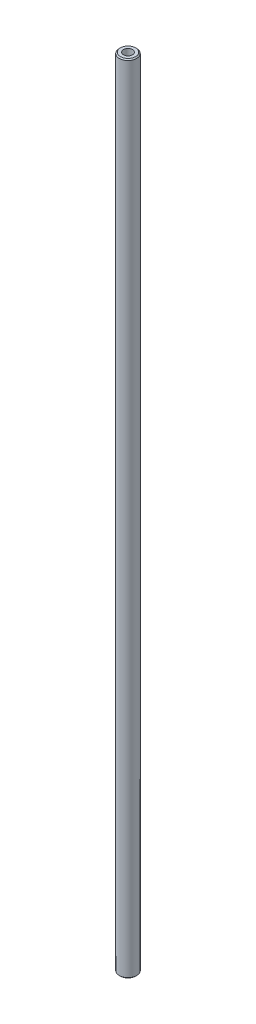
ISO-10303-21;
HEADER;
FILE_DESCRIPTION(('STEP AP214'),'2;1');
FILE_NAME('part.step','',(''),(''),'','','');
FILE_SCHEMA(('AUTOMOTIVE_DESIGN { 1 0 10303 214 1 1 1 1 }'));
ENDSEC;
DATA;
#1=APPLICATION_CONTEXT('core data for automotive mechanical design processes');
#2=APPLICATION_PROTOCOL_DEFINITION('international standard','automotive_design',2000,#1);
#3=PRODUCT_CONTEXT('',#1,'mechanical');
#4=PRODUCT('Part','Part','',(#3));
#5=PRODUCT_RELATED_PRODUCT_CATEGORY('part','',(#4));
#6=PRODUCT_DEFINITION_FORMATION('','',#4);
#7=PRODUCT_DEFINITION_CONTEXT('part definition',#1,'design');
#8=PRODUCT_DEFINITION('design','',#6,#7);
#9=PRODUCT_DEFINITION_SHAPE('','',#8);
#10=(LENGTH_UNIT() NAMED_UNIT(*) SI_UNIT(.MILLI.,.METRE.));
#11=(NAMED_UNIT(*) PLANE_ANGLE_UNIT() SI_UNIT($,.RADIAN.));
#12=(NAMED_UNIT(*) SI_UNIT($,.STERADIAN.) SOLID_ANGLE_UNIT());
#13=UNCERTAINTY_MEASURE_WITH_UNIT(LENGTH_MEASURE(1.E-05),#10,'distance_accuracy_value','');
#14=(GEOMETRIC_REPRESENTATION_CONTEXT(3) GLOBAL_UNCERTAINTY_ASSIGNED_CONTEXT((#13)) GLOBAL_UNIT_ASSIGNED_CONTEXT((#10,
#11,#12)) REPRESENTATION_CONTEXT('',''));
#15=CARTESIAN_POINT('',(0.,0.,0.));
#16=DIRECTION('',(0.,0.,1.));
#17=DIRECTION('',(1.,0.,0.));
#18=AXIS2_PLACEMENT_3D('',#15,#16,#17);
#19=CARTESIAN_POINT('',(0.,183.5,0.));
#20=DIRECTION('',(0.,-1.,0.));
#21=DIRECTION('',(0.,0.,-1.));
#22=AXIS2_PLACEMENT_3D('',#19,#20,#21);
#23=CYLINDRICAL_SURFACE('',#22,4.);
#24=CARTESIAN_POINT('',(0.,-183.,0.));
#25=DIRECTION('',(0.,1.,0.));
#26=DIRECTION('',(0.,0.,1.));
#27=AXIS2_PLACEMENT_3D('',#24,#25,#26);
#28=CIRCLE('',#27,4.);
#29=CARTESIAN_POINT('',(0.,-183.,4.));
#30=VERTEX_POINT('',#29);
#31=EDGE_CURVE('E76',#30,#30,#28,.T.);
#32=ORIENTED_EDGE('',*,*,#31,.T.);
#33=EDGE_LOOP('',(#32));
#34=FACE_BOUND('',#33,.T.);
#35=CARTESIAN_POINT('',(0.,183.,0.));
#36=DIRECTION('',(0.,1.,0.));
#37=DIRECTION('',(0.,0.,1.));
#38=AXIS2_PLACEMENT_3D('',#35,#36,#37);
#39=CIRCLE('',#38,4.);
#40=CARTESIAN_POINT('',(0.,183.,4.));
#41=VERTEX_POINT('',#40);
#42=EDGE_CURVE('E73',#41,#41,#39,.F.);
#43=ORIENTED_EDGE('',*,*,#42,.T.);
#44=EDGE_LOOP('',(#43));
#45=FACE_BOUND('',#44,.T.);
#46=ADVANCED_FACE('F38',(#34,#45),#23,.T.);
#47=CARTESIAN_POINT('',(0.,183.5,0.));
#48=DIRECTION('',(0.,1.,0.));
#49=DIRECTION('',(0.,0.,1.));
#50=AXIS2_PLACEMENT_3D('',#47,#48,#49);
#51=PLANE('',#50);
#52=CARTESIAN_POINT('',(0.,183.5,0.));
#53=DIRECTION('',(0.,1.,0.));
#54=DIRECTION('',(0.,0.,1.));
#55=AXIS2_PLACEMENT_3D('',#52,#53,#54);
#56=CIRCLE('',#55,2.09999999999999);
#57=CARTESIAN_POINT('',(0.,183.5,2.09999999999999));
#58=VERTEX_POINT('',#57);
#59=EDGE_CURVE('E62',#58,#58,#56,.T.);
#60=ORIENTED_EDGE('',*,*,#59,.F.);
#61=EDGE_LOOP('',(#60));
#62=FACE_BOUND('',#61,.T.);
#63=CARTESIAN_POINT('',(0.,183.5,0.));
#64=DIRECTION('',(0.,1.,0.));
#65=DIRECTION('',(0.,0.,1.));
#66=AXIS2_PLACEMENT_3D('',#63,#64,#65);
#67=CIRCLE('',#66,3.5);
#68=CARTESIAN_POINT('',(0.,183.5,3.5));
#69=VERTEX_POINT('',#68);
#70=EDGE_CURVE('E11',#69,#69,#67,.T.);
#71=ORIENTED_EDGE('',*,*,#70,.T.);
#72=EDGE_LOOP('',(#71));
#73=FACE_BOUND('',#72,.T.);
#74=ADVANCED_FACE('F90',(#62,#73),#51,.T.);
#75=CARTESIAN_POINT('',(0.,-183.5,0.));
#76=DIRECTION('',(0.,1.,0.));
#77=DIRECTION('',(0.,0.,1.));
#78=AXIS2_PLACEMENT_3D('',#75,#76,#77);
#79=PLANE('',#78);
#80=CARTESIAN_POINT('',(0.,-183.5,0.));
#81=DIRECTION('',(0.,-1.,0.));
#82=DIRECTION('',(0.,0.,-1.));
#83=AXIS2_PLACEMENT_3D('',#80,#81,#82);
#84=CIRCLE('',#83,2.09999999999999);
#85=CARTESIAN_POINT('',(0.,-183.5,-2.09999999999999));
#86=VERTEX_POINT('',#85);
#87=EDGE_CURVE('E63',#86,#86,#84,.T.);
#88=ORIENTED_EDGE('',*,*,#87,.F.);
#89=EDGE_LOOP('',(#88));
#90=FACE_BOUND('',#89,.T.);
#91=CARTESIAN_POINT('',(0.,-183.5,0.));
#92=DIRECTION('',(0.,1.,0.));
#93=DIRECTION('',(0.,0.,1.));
#94=AXIS2_PLACEMENT_3D('',#91,#92,#93);
#95=CIRCLE('',#94,3.49999999999995);
#96=CARTESIAN_POINT('',(0.,-183.5,3.49999999999995));
#97=VERTEX_POINT('',#96);
#98=EDGE_CURVE('E46',#97,#97,#95,.F.);
#99=ORIENTED_EDGE('',*,*,#98,.T.);
#100=EDGE_LOOP('',(#99));
#101=FACE_BOUND('',#100,.T.);
#102=ADVANCED_FACE('F81',(#90,#101),#79,.F.);
#103=CARTESIAN_POINT('',(0.,-183.,0.));
#104=DIRECTION('',(0.,1.,0.));
#105=DIRECTION('',(0.,0.,1.));
#106=AXIS2_PLACEMENT_3D('',#103,#104,#105);
#107=CONICAL_SURFACE('',#106,4.,0.785398163397445);
#108=ORIENTED_EDGE('',*,*,#98,.F.);
#109=EDGE_LOOP('',(#108));
#110=FACE_BOUND('',#109,.T.);
#111=ORIENTED_EDGE('',*,*,#31,.F.);
#112=EDGE_LOOP('',(#111));
#113=FACE_BOUND('',#112,.T.);
#114=ADVANCED_FACE('F83',(#110,#113),#107,.T.);
#115=CARTESIAN_POINT('',(0.,183.5,0.));
#116=DIRECTION('',(0.,-1.,0.));
#117=DIRECTION('',(0.,0.,-1.));
#118=AXIS2_PLACEMENT_3D('',#115,#116,#117);
#119=CONICAL_SURFACE('',#118,3.5,0.785398163397445);
#120=ORIENTED_EDGE('',*,*,#42,.F.);
#121=EDGE_LOOP('',(#120));
#122=FACE_BOUND('',#121,.T.);
#123=ORIENTED_EDGE('',*,*,#70,.F.);
#124=EDGE_LOOP('',(#123));
#125=FACE_BOUND('',#124,.T.);
#126=ADVANCED_FACE('F40',(#122,#125),#119,.T.);
#127=CARTESIAN_POINT('',(0.,159.5,0.));
#128=DIRECTION('',(0.,1.,0.));
#129=DIRECTION('',(0.,0.,1.));
#130=AXIS2_PLACEMENT_3D('',#127,#128,#129);
#131=CONICAL_SURFACE('',#130,2.09999999999999,1.02974425867665);
#132=CARTESIAN_POINT('',(0.,158.238192700042,0.));
#133=VERTEX_POINT('',#132);
#134=VERTEX_LOOP('',#133);
#135=FACE_BOUND('',#134,.T.);
#136=CARTESIAN_POINT('',(0.,159.5,0.));
#137=DIRECTION('',(0.,1.,0.));
#138=DIRECTION('',(0.,0.,1.));
#139=AXIS2_PLACEMENT_3D('',#136,#137,#138);
#140=CIRCLE('',#139,2.09999999999999);
#141=CARTESIAN_POINT('',(0.,159.5,2.09999999999999));
#142=VERTEX_POINT('',#141);
#143=EDGE_CURVE('E66',#142,#142,#140,.T.);
#144=ORIENTED_EDGE('',*,*,#143,.T.);
#145=EDGE_LOOP('',(#144));
#146=FACE_BOUND('',#145,.T.);
#147=ADVANCED_FACE('F96',(#135,#146),#131,.F.);
#148=CARTESIAN_POINT('',(0.,183.5,0.));
#149=DIRECTION('',(0.,1.,0.));
#150=DIRECTION('',(0.,0.,1.));
#151=AXIS2_PLACEMENT_3D('',#148,#149,#150);
#152=CYLINDRICAL_SURFACE('',#151,2.09999999999999);
#153=ORIENTED_EDGE('',*,*,#143,.F.);
#154=EDGE_LOOP('',(#153));
#155=FACE_BOUND('',#154,.T.);
#156=ORIENTED_EDGE('',*,*,#59,.T.);
#157=EDGE_LOOP('',(#156));
#158=FACE_BOUND('',#157,.T.);
#159=ADVANCED_FACE('F56',(#155,#158),#152,.F.);
#160=CARTESIAN_POINT('',(0.,-159.5,0.));
#161=DIRECTION('',(0.,-1.,0.));
#162=DIRECTION('',(0.,0.,-1.));
#163=AXIS2_PLACEMENT_3D('',#160,#161,#162);
#164=CONICAL_SURFACE('',#163,2.09999999999999,1.02974425867665);
#165=CARTESIAN_POINT('',(0.,-158.238192700042,0.));
#166=VERTEX_POINT('',#165);
#167=VERTEX_LOOP('',#166);
#168=FACE_BOUND('',#167,.T.);
#169=CARTESIAN_POINT('',(0.,-159.5,0.));
#170=DIRECTION('',(0.,-1.,0.));
#171=DIRECTION('',(0.,0.,-1.));
#172=AXIS2_PLACEMENT_3D('',#169,#170,#171);
#173=CIRCLE('',#172,2.09999999999999);
#174=CARTESIAN_POINT('',(0.,-159.5,-2.09999999999999));
#175=VERTEX_POINT('',#174);
#176=EDGE_CURVE('E60',#175,#175,#173,.T.);
#177=ORIENTED_EDGE('',*,*,#176,.T.);
#178=EDGE_LOOP('',(#177));
#179=FACE_BOUND('',#178,.T.);
#180=ADVANCED_FACE('F52',(#168,#179),#164,.F.);
#181=CARTESIAN_POINT('',(0.,-183.5,0.));
#182=DIRECTION('',(0.,-1.,0.));
#183=DIRECTION('',(0.,0.,-1.));
#184=AXIS2_PLACEMENT_3D('',#181,#182,#183);
#185=CYLINDRICAL_SURFACE('',#184,2.09999999999999);
#186=ORIENTED_EDGE('',*,*,#176,.F.);
#187=EDGE_LOOP('',(#186));
#188=FACE_BOUND('',#187,.T.);
#189=ORIENTED_EDGE('',*,*,#87,.T.);
#190=EDGE_LOOP('',(#189));
#191=FACE_BOUND('',#190,.T.);
#192=ADVANCED_FACE('F55',(#188,#191),#185,.F.);
#193=CLOSED_SHELL('',(#46,#74,#102,#114,#126,#147,#159,#180,#192));
#194=MANIFOLD_SOLID_BREP('B2',#193);
#195=ADVANCED_BREP_SHAPE_REPRESENTATION('',(#18,#194),#14);
#196=SHAPE_DEFINITION_REPRESENTATION(#9,#195);
ENDSEC;
END-ISO-10303-21;
